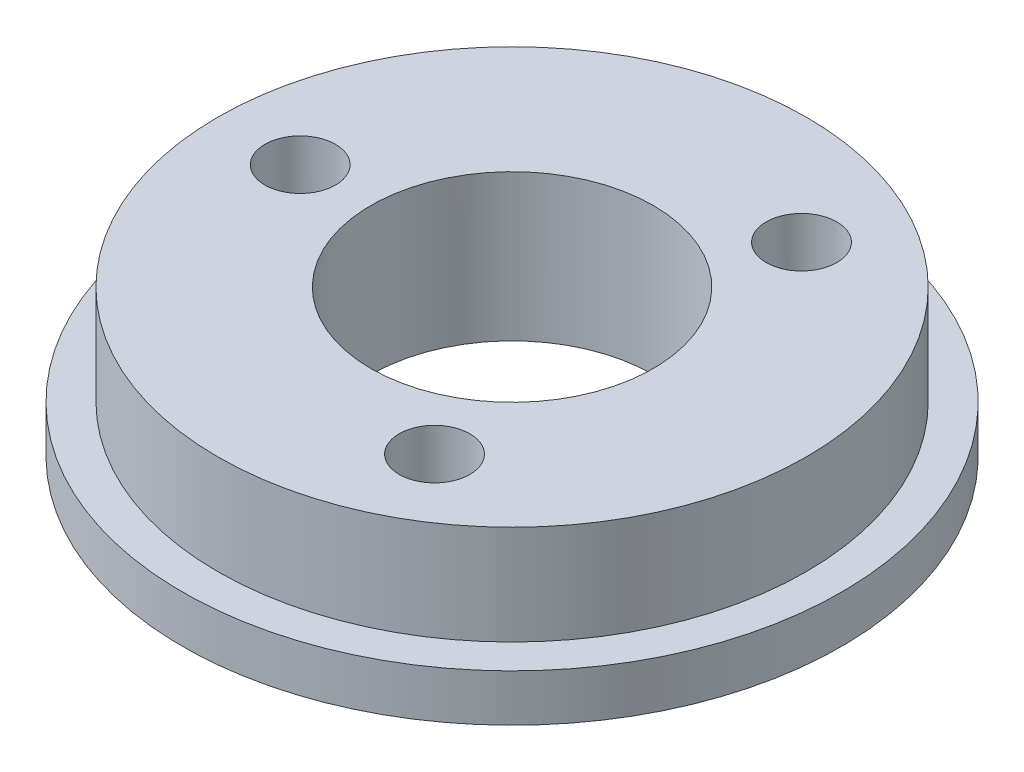
ISO-10303-21;
HEADER;
FILE_DESCRIPTION(('STEP AP214'),'2;1');
FILE_NAME('part.step','',(''),(''),'','','');
FILE_SCHEMA(('AUTOMOTIVE_DESIGN { 1 0 10303 214 1 1 1 1 }'));
ENDSEC;
DATA;
#1=APPLICATION_CONTEXT('core data for automotive mechanical design processes');
#2=APPLICATION_PROTOCOL_DEFINITION('international standard','automotive_design',2000,#1);
#3=PRODUCT_CONTEXT('',#1,'mechanical');
#4=PRODUCT('Part','Part','',(#3));
#5=PRODUCT_RELATED_PRODUCT_CATEGORY('part','',(#4));
#6=PRODUCT_DEFINITION_FORMATION('','',#4);
#7=PRODUCT_DEFINITION_CONTEXT('part definition',#1,'design');
#8=PRODUCT_DEFINITION('design','',#6,#7);
#9=PRODUCT_DEFINITION_SHAPE('','',#8);
#10=(LENGTH_UNIT() NAMED_UNIT(*) SI_UNIT(.MILLI.,.METRE.));
#11=(NAMED_UNIT(*) PLANE_ANGLE_UNIT() SI_UNIT($,.RADIAN.));
#12=(NAMED_UNIT(*) SI_UNIT($,.STERADIAN.) SOLID_ANGLE_UNIT());
#13=UNCERTAINTY_MEASURE_WITH_UNIT(LENGTH_MEASURE(1.E-05),#10,'distance_accuracy_value','');
#14=(GEOMETRIC_REPRESENTATION_CONTEXT(3) GLOBAL_UNCERTAINTY_ASSIGNED_CONTEXT((#13)) GLOBAL_UNIT_ASSIGNED_CONTEXT((#10,
#11,#12)) REPRESENTATION_CONTEXT('',''));
#15=CARTESIAN_POINT('',(0.,0.,0.));
#16=DIRECTION('',(0.,0.,1.));
#17=DIRECTION('',(1.,0.,0.));
#18=AXIS2_PLACEMENT_3D('',#15,#16,#17);
#19=CARTESIAN_POINT('',(0.,3.82356419291814,0.));
#20=DIRECTION('',(0.,1.,0.));
#21=DIRECTION('',(0.,0.,1.));
#22=AXIS2_PLACEMENT_3D('',#19,#20,#21);
#23=PLANE('',#22);
#24=CARTESIAN_POINT('',(0.,3.82356419291814,0.));
#25=DIRECTION('',(0.,1.,0.));
#26=DIRECTION('',(0.,0.,1.));
#27=AXIS2_PLACEMENT_3D('',#24,#25,#26);
#28=CIRCLE('',#27,6.);
#29=CARTESIAN_POINT('',(0.,3.82356419291814,6.));
#30=VERTEX_POINT('',#29);
#31=EDGE_CURVE('E49',#30,#30,#28,.F.);
#32=ORIENTED_EDGE('',*,*,#31,.T.);
#33=EDGE_LOOP('',(#32));
#34=FACE_BOUND('',#33,.T.);
#35=CARTESIAN_POINT('',(0.,3.82356419291814,0.));
#36=DIRECTION('',(0.,1.,0.));
#37=DIRECTION('',(0.,0.,1.));
#38=AXIS2_PLACEMENT_3D('',#35,#36,#37);
#39=CIRCLE('',#38,12.5);
#40=CARTESIAN_POINT('',(0.,3.82356419291814,12.5));
#41=VERTEX_POINT('',#40);
#42=EDGE_CURVE('E64',#41,#41,#39,.F.);
#43=ORIENTED_EDGE('',*,*,#42,.F.);
#44=EDGE_LOOP('',(#43));
#45=FACE_BOUND('',#44,.T.);
#46=CARTESIAN_POINT('',(-9.,3.82356419291814,0.));
#47=DIRECTION('',(0.,1.,0.));
#48=DIRECTION('',(0.,0.,1.));
#49=AXIS2_PLACEMENT_3D('',#46,#47,#48);
#50=CIRCLE('',#49,1.5);
#51=CARTESIAN_POINT('',(-9.,3.82356419291814,1.5));
#52=VERTEX_POINT('',#51);
#53=EDGE_CURVE('E69',#52,#52,#50,.T.);
#54=ORIENTED_EDGE('',*,*,#53,.F.);
#55=EDGE_LOOP('',(#54));
#56=FACE_BOUND('',#55,.T.);
#57=CARTESIAN_POINT('',(4.49999999999993,3.82356419291814,7.79422863405999));
#58=DIRECTION('',(0.,1.,0.));
#59=DIRECTION('',(0.,0.,1.));
#60=AXIS2_PLACEMENT_3D('',#57,#58,#59);
#61=CIRCLE('',#60,1.5);
#62=CARTESIAN_POINT('',(4.49999999999993,3.82356419291814,9.29422863405999));
#63=VERTEX_POINT('',#62);
#64=EDGE_CURVE('E73',#63,#63,#61,.T.);
#65=ORIENTED_EDGE('',*,*,#64,.F.);
#66=EDGE_LOOP('',(#65));
#67=FACE_BOUND('',#66,.T.);
#68=CARTESIAN_POINT('',(4.50000000000003,3.82356419291814,-7.79422863405993));
#69=DIRECTION('',(0.,1.,0.));
#70=DIRECTION('',(0.,0.,1.));
#71=AXIS2_PLACEMENT_3D('',#68,#69,#70);
#72=CIRCLE('',#71,1.5);
#73=CARTESIAN_POINT('',(4.50000000000003,3.82356419291814,-6.29422863405992));
#74=VERTEX_POINT('',#73);
#75=EDGE_CURVE('E76',#74,#74,#72,.T.);
#76=ORIENTED_EDGE('',*,*,#75,.F.);
#77=EDGE_LOOP('',(#76));
#78=FACE_BOUND('',#77,.T.);
#79=ADVANCED_FACE('F45',(#34,#45,#56,#67,#78),#23,.T.);
#80=CARTESIAN_POINT('',(0.,0.,0.));
#81=DIRECTION('',(0.,-1.,0.));
#82=DIRECTION('',(0.,0.,-1.));
#83=AXIS2_PLACEMENT_3D('',#80,#81,#82);
#84=CYLINDRICAL_SURFACE('',#83,14.);
#85=CARTESIAN_POINT('',(0.,-2.4,0.));
#86=DIRECTION('',(0.,-1.,0.));
#87=DIRECTION('',(0.,0.,-1.));
#88=AXIS2_PLACEMENT_3D('',#85,#86,#87);
#89=CIRCLE('',#88,14.);
#90=CARTESIAN_POINT('',(0.,-2.4,-14.));
#91=VERTEX_POINT('',#90);
#92=EDGE_CURVE('E60',#91,#91,#89,.T.);
#93=ORIENTED_EDGE('',*,*,#92,.F.);
#94=EDGE_LOOP('',(#93));
#95=FACE_BOUND('',#94,.T.);
#96=CARTESIAN_POINT('',(0.,-0.400000000000002,0.));
#97=DIRECTION('',(0.,-1.,0.));
#98=DIRECTION('',(0.,0.,-1.));
#99=AXIS2_PLACEMENT_3D('',#96,#97,#98);
#100=CIRCLE('',#99,14.);
#101=CARTESIAN_POINT('',(0.,-0.400000000000002,-14.));
#102=VERTEX_POINT('',#101);
#103=EDGE_CURVE('E54',#102,#102,#100,.T.);
#104=ORIENTED_EDGE('',*,*,#103,.T.);
#105=EDGE_LOOP('',(#104));
#106=FACE_BOUND('',#105,.T.);
#107=ADVANCED_FACE('F109',(#95,#106),#84,.T.);
#108=CARTESIAN_POINT('',(-12.5,-0.400000000000002,0.));
#109=DIRECTION('',(0.,-1.,0.));
#110=DIRECTION('',(0.,0.,-1.));
#111=AXIS2_PLACEMENT_3D('',#108,#109,#110);
#112=PLANE('',#111);
#113=ORIENTED_EDGE('',*,*,#103,.F.);
#114=EDGE_LOOP('',(#113));
#115=FACE_BOUND('',#114,.T.);
#116=CARTESIAN_POINT('',(0.,-0.400000000000002,0.));
#117=DIRECTION('',(0.,-1.,0.));
#118=DIRECTION('',(0.,0.,-1.));
#119=AXIS2_PLACEMENT_3D('',#116,#117,#118);
#120=CIRCLE('',#119,12.5);
#121=CARTESIAN_POINT('',(0.,-0.400000000000002,-12.5));
#122=VERTEX_POINT('',#121);
#123=EDGE_CURVE('E10',#122,#122,#120,.T.);
#124=ORIENTED_EDGE('',*,*,#123,.T.);
#125=EDGE_LOOP('',(#124));
#126=FACE_BOUND('',#125,.T.);
#127=ADVANCED_FACE('F112',(#115,#126),#112,.F.);
#128=CARTESIAN_POINT('',(0.,9.51,0.));
#129=DIRECTION('',(0.,1.,0.));
#130=DIRECTION('',(-1.,0.,0.));
#131=AXIS2_PLACEMENT_3D('',#128,#129,#130);
#132=CYLINDRICAL_SURFACE('',#131,12.5);
#133=ORIENTED_EDGE('',*,*,#123,.F.);
#134=EDGE_LOOP('',(#133));
#135=FACE_BOUND('',#134,.T.);
#136=ORIENTED_EDGE('',*,*,#42,.T.);
#137=EDGE_LOOP('',(#136));
#138=FACE_BOUND('',#137,.T.);
#139=ADVANCED_FACE('F47',(#135,#138),#132,.T.);
#140=CARTESIAN_POINT('',(-6.,-2.4,0.));
#141=DIRECTION('',(0.,1.,0.));
#142=DIRECTION('',(0.,0.,1.));
#143=AXIS2_PLACEMENT_3D('',#140,#141,#142);
#144=PLANE('',#143);
#145=CARTESIAN_POINT('',(0.,-2.4,0.));
#146=DIRECTION('',(0.,-1.,0.));
#147=DIRECTION('',(0.,0.,-1.));
#148=AXIS2_PLACEMENT_3D('',#145,#146,#147);
#149=CIRCLE('',#148,6.);
#150=CARTESIAN_POINT('',(0.,-2.4,-6.));
#151=VERTEX_POINT('',#150);
#152=EDGE_CURVE('E68',#151,#151,#149,.T.);
#153=ORIENTED_EDGE('',*,*,#152,.F.);
#154=EDGE_LOOP('',(#153));
#155=FACE_BOUND('',#154,.T.);
#156=ORIENTED_EDGE('',*,*,#92,.T.);
#157=EDGE_LOOP('',(#156));
#158=FACE_BOUND('',#157,.T.);
#159=CARTESIAN_POINT('',(-9.,-2.4,0.));
#160=DIRECTION('',(0.,-1.,0.));
#161=DIRECTION('',(0.,0.,-1.));
#162=AXIS2_PLACEMENT_3D('',#159,#160,#161);
#163=CIRCLE('',#162,1.5);
#164=CARTESIAN_POINT('',(-9.,-2.4,-1.49999999999999));
#165=VERTEX_POINT('',#164);
#166=EDGE_CURVE('E94',#165,#165,#163,.T.);
#167=ORIENTED_EDGE('',*,*,#166,.F.);
#168=EDGE_LOOP('',(#167));
#169=FACE_BOUND('',#168,.T.);
#170=CARTESIAN_POINT('',(4.50000000000003,-2.4,-7.79422863405993));
#171=DIRECTION('',(0.,-1.,0.));
#172=DIRECTION('',(0.,0.,-1.));
#173=AXIS2_PLACEMENT_3D('',#170,#171,#172);
#174=CIRCLE('',#173,1.5);
#175=CARTESIAN_POINT('',(4.50000000000003,-2.4,-9.29422863405993));
#176=VERTEX_POINT('',#175);
#177=EDGE_CURVE('E88',#176,#176,#174,.T.);
#178=ORIENTED_EDGE('',*,*,#177,.F.);
#179=EDGE_LOOP('',(#178));
#180=FACE_BOUND('',#179,.T.);
#181=CARTESIAN_POINT('',(4.49999999999993,-2.4,7.79422863405999));
#182=DIRECTION('',(0.,-1.,0.));
#183=DIRECTION('',(0.,0.,-1.));
#184=AXIS2_PLACEMENT_3D('',#181,#182,#183);
#185=CIRCLE('',#184,1.5);
#186=CARTESIAN_POINT('',(4.49999999999993,-2.4,6.29422863405999));
#187=VERTEX_POINT('',#186);
#188=EDGE_CURVE('E83',#187,#187,#185,.T.);
#189=ORIENTED_EDGE('',*,*,#188,.F.);
#190=EDGE_LOOP('',(#189));
#191=FACE_BOUND('',#190,.T.);
#192=ADVANCED_FACE('F106',(#155,#158,#169,#180,#191),#144,.F.);
#193=CARTESIAN_POINT('',(0.,9.50999999999997,0.));
#194=DIRECTION('',(0.,-1.,0.));
#195=DIRECTION('',(1.,0.,0.));
#196=AXIS2_PLACEMENT_3D('',#193,#194,#195);
#197=CYLINDRICAL_SURFACE('',#196,6.);
#198=ORIENTED_EDGE('',*,*,#152,.T.);
#199=EDGE_LOOP('',(#198));
#200=FACE_BOUND('',#199,.T.);
#201=ORIENTED_EDGE('',*,*,#31,.F.);
#202=EDGE_LOOP('',(#201));
#203=FACE_BOUND('',#202,.T.);
#204=ADVANCED_FACE('F135',(#200,#203),#197,.F.);
#205=CARTESIAN_POINT('',(-9.,20.9846888989347,0.));
#206=DIRECTION('',(0.,-1.,0.));
#207=DIRECTION('',(0.,0.,-1.));
#208=AXIS2_PLACEMENT_3D('',#205,#206,#207);
#209=CYLINDRICAL_SURFACE('',#208,1.5);
#210=ORIENTED_EDGE('',*,*,#53,.T.);
#211=EDGE_LOOP('',(#210));
#212=FACE_BOUND('',#211,.T.);
#213=ORIENTED_EDGE('',*,*,#166,.T.);
#214=EDGE_LOOP('',(#213));
#215=FACE_BOUND('',#214,.T.);
#216=ADVANCED_FACE('F132',(#212,#215),#209,.F.);
#217=CARTESIAN_POINT('',(4.49999999999993,20.9846888989347,7.79422863405999));
#218=DIRECTION('',(0.,-1.,0.));
#219=DIRECTION('',(0.,0.,-1.));
#220=AXIS2_PLACEMENT_3D('',#217,#218,#219);
#221=CYLINDRICAL_SURFACE('',#220,1.5);
#222=ORIENTED_EDGE('',*,*,#64,.T.);
#223=EDGE_LOOP('',(#222));
#224=FACE_BOUND('',#223,.T.);
#225=ORIENTED_EDGE('',*,*,#188,.T.);
#226=EDGE_LOOP('',(#225));
#227=FACE_BOUND('',#226,.T.);
#228=ADVANCED_FACE('F129',(#224,#227),#221,.F.);
#229=CARTESIAN_POINT('',(4.50000000000003,20.9846888989347,-7.79422863405993));
#230=DIRECTION('',(0.,-1.,0.));
#231=DIRECTION('',(0.,0.,-1.));
#232=AXIS2_PLACEMENT_3D('',#229,#230,#231);
#233=CYLINDRICAL_SURFACE('',#232,1.5);
#234=ORIENTED_EDGE('',*,*,#75,.T.);
#235=EDGE_LOOP('',(#234));
#236=FACE_BOUND('',#235,.T.);
#237=ORIENTED_EDGE('',*,*,#177,.T.);
#238=EDGE_LOOP('',(#237));
#239=FACE_BOUND('',#238,.T.);
#240=ADVANCED_FACE('F126',(#236,#239),#233,.F.);
#241=CLOSED_SHELL('',(#79,#107,#127,#139,#192,#204,#216,#228,#240));
#242=MANIFOLD_SOLID_BREP('B2',#241);
#243=ADVANCED_BREP_SHAPE_REPRESENTATION('',(#18,#242),#14);
#244=SHAPE_DEFINITION_REPRESENTATION(#9,#243);
ENDSEC;
END-ISO-10303-21;
